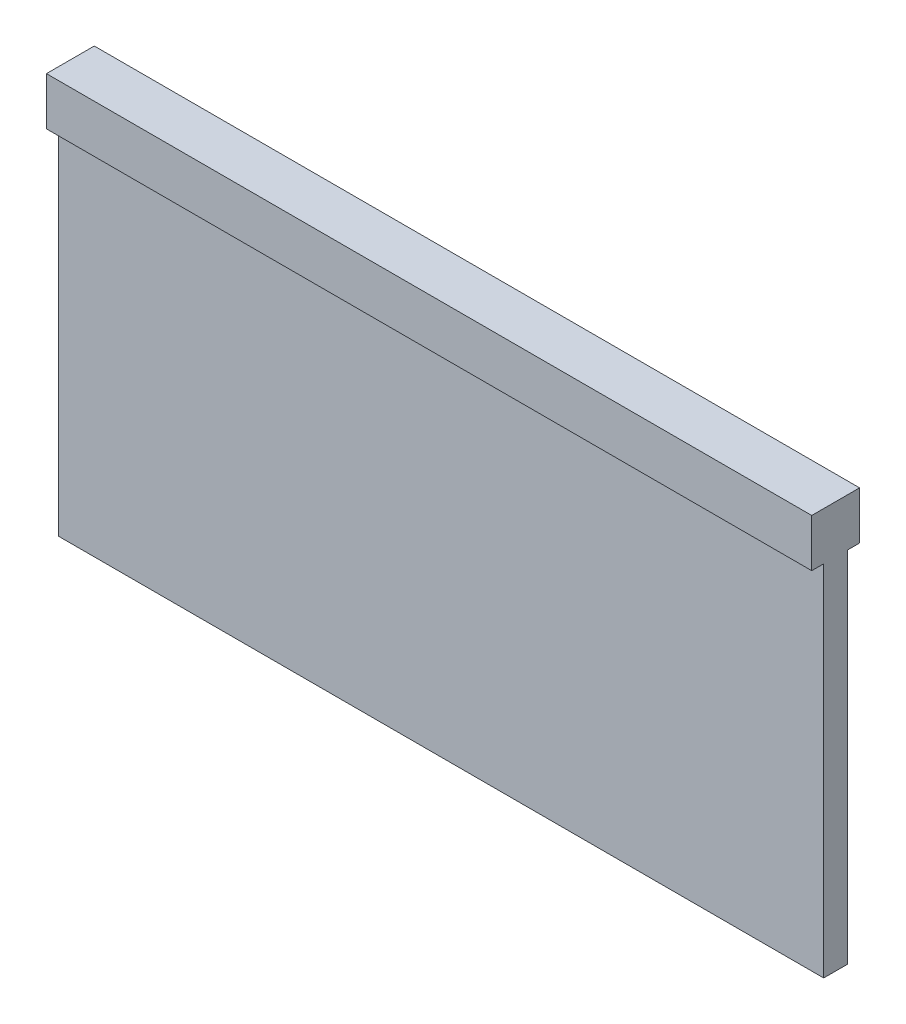
ISO-10303-21;
HEADER;
FILE_DESCRIPTION(('STEP AP214'),'2;1');
FILE_NAME('part.step','',(''),(''),'','','');
FILE_SCHEMA(('AUTOMOTIVE_DESIGN { 1 0 10303 214 1 1 1 1 }'));
ENDSEC;
DATA;
#1=APPLICATION_CONTEXT('core data for automotive mechanical design processes');
#2=APPLICATION_PROTOCOL_DEFINITION('international standard','automotive_design',2000,#1);
#3=PRODUCT_CONTEXT('',#1,'mechanical');
#4=PRODUCT('Part','Part','',(#3));
#5=PRODUCT_RELATED_PRODUCT_CATEGORY('part','',(#4));
#6=PRODUCT_DEFINITION_FORMATION('','',#4);
#7=PRODUCT_DEFINITION_CONTEXT('part definition',#1,'design');
#8=PRODUCT_DEFINITION('design','',#6,#7);
#9=PRODUCT_DEFINITION_SHAPE('','',#8);
#10=(LENGTH_UNIT() NAMED_UNIT(*) SI_UNIT(.MILLI.,.METRE.));
#11=(NAMED_UNIT(*) PLANE_ANGLE_UNIT() SI_UNIT($,.RADIAN.));
#12=(NAMED_UNIT(*) SI_UNIT($,.STERADIAN.) SOLID_ANGLE_UNIT());
#13=UNCERTAINTY_MEASURE_WITH_UNIT(LENGTH_MEASURE(1.E-05),#10,'distance_accuracy_value','');
#14=(GEOMETRIC_REPRESENTATION_CONTEXT(3) GLOBAL_UNCERTAINTY_ASSIGNED_CONTEXT((#13)) GLOBAL_UNIT_ASSIGNED_CONTEXT((#10,
#11,#12)) REPRESENTATION_CONTEXT('',''));
#15=CARTESIAN_POINT('',(0.,0.,0.));
#16=DIRECTION('',(0.,0.,1.));
#17=DIRECTION('',(1.,0.,0.));
#18=AXIS2_PLACEMENT_3D('',#15,#16,#17);
#19=CARTESIAN_POINT('',(-203.2,-107.95,12.7));
#20=DIRECTION('',(0.,1.,0.));
#21=DIRECTION('',(0.,0.,1.));
#22=AXIS2_PLACEMENT_3D('',#19,#20,#21);
#23=PLANE('',#22);
#24=DIRECTION('',(1.,0.,0.));
#25=VECTOR('',#24,1.);
#26=CARTESIAN_POINT('',(-203.2,-107.95,-6.35));
#27=LINE('',#26,#25);
#28=CARTESIAN_POINT('',(-203.2,-107.95,-6.35));
#29=VERTEX_POINT('',#28);
#30=CARTESIAN_POINT('',(203.2,-107.95,-6.35));
#31=VERTEX_POINT('',#30);
#32=EDGE_CURVE('E118',#29,#31,#27,.T.);
#33=ORIENTED_EDGE('',*,*,#32,.T.);
#34=DIRECTION('',(0.,0.,-1.));
#35=VECTOR('',#34,1.);
#36=CARTESIAN_POINT('',(203.2,-107.95,12.7));
#37=LINE('',#36,#35);
#38=CARTESIAN_POINT('',(203.2,-107.95,6.35));
#39=VERTEX_POINT('',#38);
#40=EDGE_CURVE('E48',#39,#31,#37,.T.);
#41=ORIENTED_EDGE('',*,*,#40,.F.);
#42=DIRECTION('',(1.,0.,0.));
#43=VECTOR('',#42,1.);
#44=CARTESIAN_POINT('',(-203.2,-107.95,6.35));
#45=LINE('',#44,#43);
#46=CARTESIAN_POINT('',(-203.2,-107.95,6.35));
#47=VERTEX_POINT('',#46);
#48=EDGE_CURVE('E140',#47,#39,#45,.T.);
#49=ORIENTED_EDGE('',*,*,#48,.F.);
#50=DIRECTION('',(0.,0.,-1.));
#51=VECTOR('',#50,1.);
#52=CARTESIAN_POINT('',(-203.2,-107.95,12.7));
#53=LINE('',#52,#51);
#54=EDGE_CURVE('E11',#47,#29,#53,.T.);
#55=ORIENTED_EDGE('',*,*,#54,.T.);
#56=EDGE_LOOP('',(#33,#41,#49,#55));
#57=FACE_BOUND('',#56,.T.);
#58=ADVANCED_FACE('F39',(#57),#23,.F.);
#59=CARTESIAN_POINT('',(-203.2,107.95,12.7));
#60=DIRECTION('',(1.,0.,0.));
#61=DIRECTION('',(0.,0.,-1.));
#62=AXIS2_PLACEMENT_3D('',#59,#60,#61);
#63=PLANE('',#62);
#64=DIRECTION('',(0.,0.,-1.));
#65=VECTOR('',#64,1.);
#66=CARTESIAN_POINT('',(-203.2,82.55,-6.35));
#67=LINE('',#66,#65);
#68=CARTESIAN_POINT('',(-203.2,82.55,-6.35));
#69=VERTEX_POINT('',#68);
#70=CARTESIAN_POINT('',(-203.2,82.55,-12.7));
#71=VERTEX_POINT('',#70);
#72=EDGE_CURVE('E55',#69,#71,#67,.T.);
#73=ORIENTED_EDGE('',*,*,#72,.F.);
#74=DIRECTION('',(0.,-1.,0.));
#75=VECTOR('',#74,1.);
#76=CARTESIAN_POINT('',(-203.2,82.55,-6.35));
#77=LINE('',#76,#75);
#78=EDGE_CURVE('E113',#69,#29,#77,.T.);
#79=ORIENTED_EDGE('',*,*,#78,.T.);
#80=ORIENTED_EDGE('',*,*,#54,.F.);
#81=DIRECTION('',(0.,-1.,0.));
#82=VECTOR('',#81,1.);
#83=CARTESIAN_POINT('',(-203.2,82.55,6.35));
#84=LINE('',#83,#82);
#85=CARTESIAN_POINT('',(-203.2,82.55,6.35));
#86=VERTEX_POINT('',#85);
#87=EDGE_CURVE('E137',#86,#47,#84,.T.);
#88=ORIENTED_EDGE('',*,*,#87,.F.);
#89=DIRECTION('',(0.,0.,1.));
#90=VECTOR('',#89,1.);
#91=CARTESIAN_POINT('',(-203.2,82.55,6.35));
#92=LINE('',#91,#90);
#93=CARTESIAN_POINT('',(-203.2,82.55,12.7));
#94=VERTEX_POINT('',#93);
#95=EDGE_CURVE('E152',#86,#94,#92,.T.);
#96=ORIENTED_EDGE('',*,*,#95,.T.);
#97=DIRECTION('',(0.,-1.,0.));
#98=VECTOR('',#97,1.);
#99=CARTESIAN_POINT('',(-203.2,107.95,12.7));
#100=LINE('',#99,#98);
#101=CARTESIAN_POINT('',(-203.2,107.95,12.7));
#102=VERTEX_POINT('',#101);
#103=EDGE_CURVE('E158',#102,#94,#100,.T.);
#104=ORIENTED_EDGE('',*,*,#103,.F.);
#105=DIRECTION('',(0.,0.,-1.));
#106=VECTOR('',#105,1.);
#107=CARTESIAN_POINT('',(-203.2,107.95,12.7));
#108=LINE('',#107,#106);
#109=CARTESIAN_POINT('',(-203.2,107.95,-12.7));
#110=VERTEX_POINT('',#109);
#111=EDGE_CURVE('E169',#102,#110,#108,.T.);
#112=ORIENTED_EDGE('',*,*,#111,.T.);
#113=DIRECTION('',(0.,-1.,0.));
#114=VECTOR('',#113,1.);
#115=CARTESIAN_POINT('',(-203.2,107.95,-12.7));
#116=LINE('',#115,#114);
#117=EDGE_CURVE('E127',#110,#71,#116,.T.);
#118=ORIENTED_EDGE('',*,*,#117,.T.);
#119=EDGE_LOOP('',(#73,#79,#80,#88,#96,#104,#112,#118));
#120=FACE_BOUND('',#119,.T.);
#121=ADVANCED_FACE('F41',(#120),#63,.F.);
#122=CARTESIAN_POINT('',(203.2,107.95,12.7));
#123=DIRECTION('',(-1.,0.,0.));
#124=DIRECTION('',(0.,0.,1.));
#125=AXIS2_PLACEMENT_3D('',#122,#123,#124);
#126=PLANE('',#125);
#127=DIRECTION('',(0.,0.,-1.));
#128=VECTOR('',#127,1.);
#129=CARTESIAN_POINT('',(203.2,82.55,-6.35));
#130=LINE('',#129,#128);
#131=CARTESIAN_POINT('',(203.2,82.55,-6.35));
#132=VERTEX_POINT('',#131);
#133=CARTESIAN_POINT('',(203.2,82.55,-12.7));
#134=VERTEX_POINT('',#133);
#135=EDGE_CURVE('E108',#132,#134,#130,.T.);
#136=ORIENTED_EDGE('',*,*,#135,.T.);
#137=DIRECTION('',(0.,1.,0.));
#138=VECTOR('',#137,1.);
#139=CARTESIAN_POINT('',(203.2,107.95,-12.7));
#140=LINE('',#139,#138);
#141=CARTESIAN_POINT('',(203.2,107.95,-12.7));
#142=VERTEX_POINT('',#141);
#143=EDGE_CURVE('E172',#134,#142,#140,.T.);
#144=ORIENTED_EDGE('',*,*,#143,.T.);
#145=DIRECTION('',(0.,0.,-1.));
#146=VECTOR('',#145,1.);
#147=CARTESIAN_POINT('',(203.2,107.95,12.7));
#148=LINE('',#147,#146);
#149=CARTESIAN_POINT('',(203.2,107.95,12.7));
#150=VERTEX_POINT('',#149);
#151=EDGE_CURVE('E179',#150,#142,#148,.T.);
#152=ORIENTED_EDGE('',*,*,#151,.F.);
#153=DIRECTION('',(0.,1.,0.));
#154=VECTOR('',#153,1.);
#155=CARTESIAN_POINT('',(203.2,107.95,12.7));
#156=LINE('',#155,#154);
#157=CARTESIAN_POINT('',(203.2,82.55,12.7));
#158=VERTEX_POINT('',#157);
#159=EDGE_CURVE('E162',#158,#150,#156,.T.);
#160=ORIENTED_EDGE('',*,*,#159,.F.);
#161=DIRECTION('',(0.,0.,1.));
#162=VECTOR('',#161,1.);
#163=CARTESIAN_POINT('',(203.2,82.55,6.35));
#164=LINE('',#163,#162);
#165=CARTESIAN_POINT('',(203.2,82.55,6.35));
#166=VERTEX_POINT('',#165);
#167=EDGE_CURVE('E63',#166,#158,#164,.T.);
#168=ORIENTED_EDGE('',*,*,#167,.F.);
#169=DIRECTION('',(0.,1.,0.));
#170=VECTOR('',#169,1.);
#171=CARTESIAN_POINT('',(203.2,82.55,6.35));
#172=LINE('',#171,#170);
#173=EDGE_CURVE('E143',#39,#166,#172,.T.);
#174=ORIENTED_EDGE('',*,*,#173,.F.);
#175=ORIENTED_EDGE('',*,*,#40,.T.);
#176=DIRECTION('',(0.,1.,0.));
#177=VECTOR('',#176,1.);
#178=CARTESIAN_POINT('',(203.2,82.55,-6.35));
#179=LINE('',#178,#177);
#180=EDGE_CURVE('E112',#31,#132,#179,.T.);
#181=ORIENTED_EDGE('',*,*,#180,.T.);
#182=EDGE_LOOP('',(#136,#144,#152,#160,#168,#174,#175,#181));
#183=FACE_BOUND('',#182,.T.);
#184=ADVANCED_FACE('F187',(#183),#126,.F.);
#185=CARTESIAN_POINT('',(0.,0.,-12.7));
#186=DIRECTION('',(0.,0.,1.));
#187=DIRECTION('',(1.,0.,0.));
#188=AXIS2_PLACEMENT_3D('',#185,#186,#187);
#189=PLANE('',#188);
#190=DIRECTION('',(-1.,0.,0.));
#191=VECTOR('',#190,1.);
#192=CARTESIAN_POINT('',(-203.2,82.55,-12.7));
#193=LINE('',#192,#191);
#194=EDGE_CURVE('E122',#134,#71,#193,.T.);
#195=ORIENTED_EDGE('',*,*,#194,.T.);
#196=ORIENTED_EDGE('',*,*,#117,.F.);
#197=DIRECTION('',(-1.,0.,0.));
#198=VECTOR('',#197,1.);
#199=CARTESIAN_POINT('',(-203.2,107.95,-12.7));
#200=LINE('',#199,#198);
#201=EDGE_CURVE('E163',#142,#110,#200,.T.);
#202=ORIENTED_EDGE('',*,*,#201,.F.);
#203=ORIENTED_EDGE('',*,*,#143,.F.);
#204=EDGE_LOOP('',(#195,#196,#202,#203));
#205=FACE_BOUND('',#204,.T.);
#206=ADVANCED_FACE('F204',(#205),#189,.F.);
#207=CARTESIAN_POINT('',(-203.2,107.95,12.7));
#208=DIRECTION('',(0.,-1.,0.));
#209=DIRECTION('',(0.,0.,-1.));
#210=AXIS2_PLACEMENT_3D('',#207,#208,#209);
#211=PLANE('',#210);
#212=ORIENTED_EDGE('',*,*,#201,.T.);
#213=ORIENTED_EDGE('',*,*,#111,.F.);
#214=DIRECTION('',(-1.,0.,0.));
#215=VECTOR('',#214,1.);
#216=CARTESIAN_POINT('',(-203.2,107.95,12.7));
#217=LINE('',#216,#215);
#218=EDGE_CURVE('E166',#150,#102,#217,.T.);
#219=ORIENTED_EDGE('',*,*,#218,.F.);
#220=ORIENTED_EDGE('',*,*,#151,.T.);
#221=EDGE_LOOP('',(#212,#213,#219,#220));
#222=FACE_BOUND('',#221,.T.);
#223=ADVANCED_FACE('F209',(#222),#211,.F.);
#224=CARTESIAN_POINT('',(0.,0.,12.7));
#225=DIRECTION('',(0.,0.,1.));
#226=DIRECTION('',(1.,0.,0.));
#227=AXIS2_PLACEMENT_3D('',#224,#225,#226);
#228=PLANE('',#227);
#229=DIRECTION('',(-1.,0.,0.));
#230=VECTOR('',#229,1.);
#231=CARTESIAN_POINT('',(-203.2,82.55,12.7));
#232=LINE('',#231,#230);
#233=EDGE_CURVE('E132',#158,#94,#232,.T.);
#234=ORIENTED_EDGE('',*,*,#233,.F.);
#235=ORIENTED_EDGE('',*,*,#159,.T.);
#236=ORIENTED_EDGE('',*,*,#218,.T.);
#237=ORIENTED_EDGE('',*,*,#103,.T.);
#238=EDGE_LOOP('',(#234,#235,#236,#237));
#239=FACE_BOUND('',#238,.T.);
#240=ADVANCED_FACE('F199',(#239),#228,.T.);
#241=CARTESIAN_POINT('',(-203.2,82.55,6.35));
#242=DIRECTION('',(0.,1.,0.));
#243=DIRECTION('',(0.,0.,1.));
#244=AXIS2_PLACEMENT_3D('',#241,#242,#243);
#245=PLANE('',#244);
#246=ORIENTED_EDGE('',*,*,#233,.T.);
#247=ORIENTED_EDGE('',*,*,#95,.F.);
#248=DIRECTION('',(-1.,0.,0.));
#249=VECTOR('',#248,1.);
#250=CARTESIAN_POINT('',(-203.2,82.55,6.35));
#251=LINE('',#250,#249);
#252=EDGE_CURVE('E146',#166,#86,#251,.T.);
#253=ORIENTED_EDGE('',*,*,#252,.F.);
#254=ORIENTED_EDGE('',*,*,#167,.T.);
#255=EDGE_LOOP('',(#246,#247,#253,#254));
#256=FACE_BOUND('',#255,.T.);
#257=ADVANCED_FACE('F194',(#256),#245,.F.);
#258=CARTESIAN_POINT('',(0.,0.,6.35));
#259=DIRECTION('',(0.,0.,1.));
#260=DIRECTION('',(1.,0.,0.));
#261=AXIS2_PLACEMENT_3D('',#258,#259,#260);
#262=PLANE('',#261);
#263=ORIENTED_EDGE('',*,*,#87,.T.);
#264=ORIENTED_EDGE('',*,*,#48,.T.);
#265=ORIENTED_EDGE('',*,*,#173,.T.);
#266=ORIENTED_EDGE('',*,*,#252,.T.);
#267=EDGE_LOOP('',(#263,#264,#265,#266));
#268=FACE_BOUND('',#267,.T.);
#269=ADVANCED_FACE('F193',(#268),#262,.T.);
#270=CARTESIAN_POINT('',(-203.2,82.55,-6.35));
#271=DIRECTION('',(0.,-1.,0.));
#272=DIRECTION('',(0.,0.,-1.));
#273=AXIS2_PLACEMENT_3D('',#270,#271,#272);
#274=PLANE('',#273);
#275=ORIENTED_EDGE('',*,*,#194,.F.);
#276=ORIENTED_EDGE('',*,*,#135,.F.);
#277=DIRECTION('',(-1.,0.,0.));
#278=VECTOR('',#277,1.);
#279=CARTESIAN_POINT('',(-203.2,82.55,-6.35));
#280=LINE('',#279,#278);
#281=EDGE_CURVE('E104',#132,#69,#280,.T.);
#282=ORIENTED_EDGE('',*,*,#281,.T.);
#283=ORIENTED_EDGE('',*,*,#72,.T.);
#284=EDGE_LOOP('',(#275,#276,#282,#283));
#285=FACE_BOUND('',#284,.T.);
#286=ADVANCED_FACE('F106',(#285),#274,.T.);
#287=CARTESIAN_POINT('',(0.,0.,-6.35));
#288=DIRECTION('',(0.,0.,-1.));
#289=DIRECTION('',(1.,0.,0.));
#290=AXIS2_PLACEMENT_3D('',#287,#288,#289);
#291=PLANE('',#290);
#292=ORIENTED_EDGE('',*,*,#78,.F.);
#293=ORIENTED_EDGE('',*,*,#281,.F.);
#294=ORIENTED_EDGE('',*,*,#180,.F.);
#295=ORIENTED_EDGE('',*,*,#32,.F.);
#296=EDGE_LOOP('',(#292,#293,#294,#295));
#297=FACE_BOUND('',#296,.T.);
#298=ADVANCED_FACE('F116',(#297),#291,.T.);
#299=CLOSED_SHELL('',(#58,#121,#184,#206,#223,#240,#257,#269,#286,#298));
#300=MANIFOLD_SOLID_BREP('B2',#299);
#301=ADVANCED_BREP_SHAPE_REPRESENTATION('',(#18,#300),#14);
#302=SHAPE_DEFINITION_REPRESENTATION(#9,#301);
ENDSEC;
END-ISO-10303-21;
